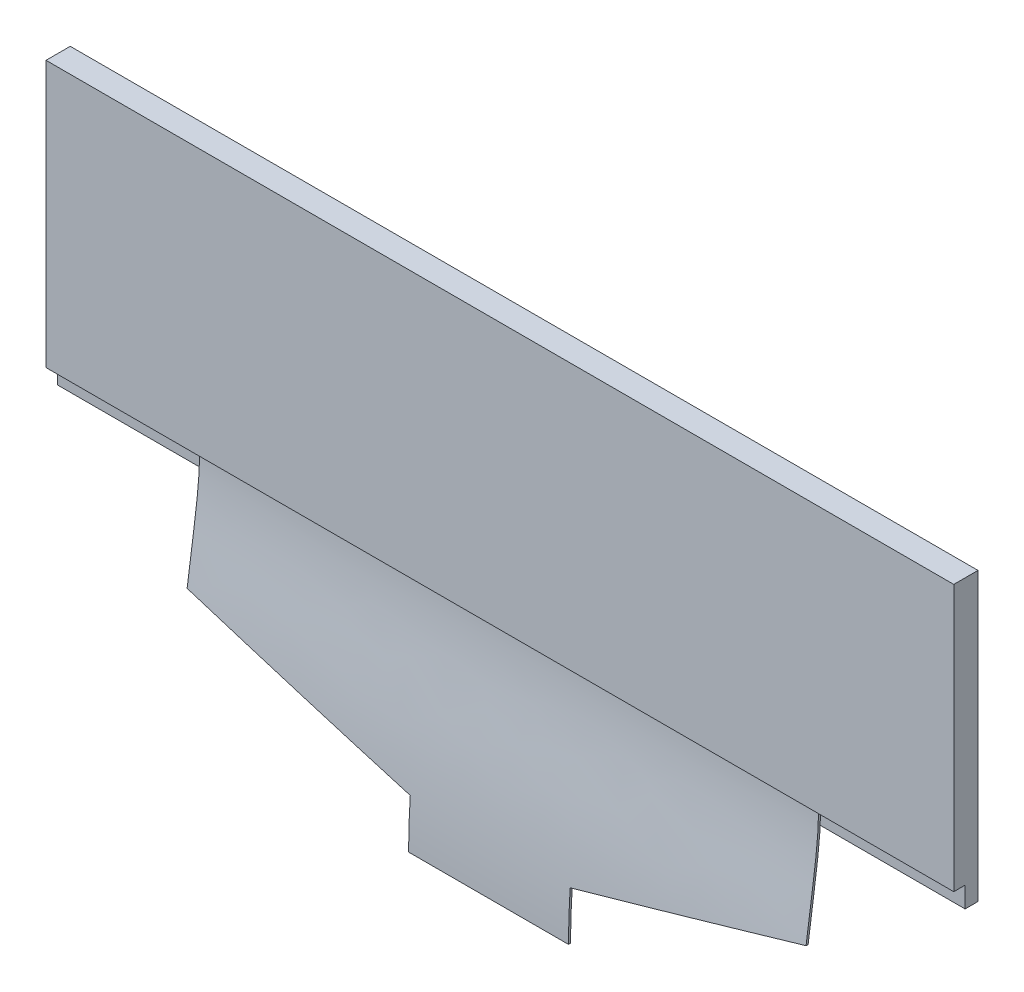
ISO-10303-21;
HEADER;
FILE_DESCRIPTION(('STEP AP214'),'2;1');
FILE_NAME('part.step','',(''),(''),'','','');
FILE_SCHEMA(('AUTOMOTIVE_DESIGN { 1 0 10303 214 1 1 1 1 }'));
ENDSEC;
DATA;
#1=APPLICATION_CONTEXT('core data for automotive mechanical design processes');
#2=APPLICATION_PROTOCOL_DEFINITION('international standard','automotive_design',2000,#1);
#3=PRODUCT_CONTEXT('',#1,'mechanical');
#4=PRODUCT('Part','Part','',(#3));
#5=PRODUCT_RELATED_PRODUCT_CATEGORY('part','',(#4));
#6=PRODUCT_DEFINITION_FORMATION('','',#4);
#7=PRODUCT_DEFINITION_CONTEXT('part definition',#1,'design');
#8=PRODUCT_DEFINITION('design','',#6,#7);
#9=PRODUCT_DEFINITION_SHAPE('','',#8);
#10=(LENGTH_UNIT() NAMED_UNIT(*) SI_UNIT(.MILLI.,.METRE.));
#11=(NAMED_UNIT(*) PLANE_ANGLE_UNIT() SI_UNIT($,.RADIAN.));
#12=(NAMED_UNIT(*) SI_UNIT($,.STERADIAN.) SOLID_ANGLE_UNIT());
#13=UNCERTAINTY_MEASURE_WITH_UNIT(LENGTH_MEASURE(1.E-05),#10,'distance_accuracy_value','');
#14=(GEOMETRIC_REPRESENTATION_CONTEXT(3) GLOBAL_UNCERTAINTY_ASSIGNED_CONTEXT((#13)) GLOBAL_UNIT_ASSIGNED_CONTEXT((#10,
#11,#12)) REPRESENTATION_CONTEXT('',''));
#15=CARTESIAN_POINT('',(0.,0.,0.));
#16=DIRECTION('',(0.,0.,1.));
#17=DIRECTION('',(1.,0.,0.));
#18=AXIS2_PLACEMENT_3D('',#15,#16,#17);
#19=CARTESIAN_POINT('',(74.,-36.0727483844429,2.25));
#20=DIRECTION('',(-1.,0.,0.));
#21=DIRECTION('',(0.,0.,1.));
#22=AXIS2_PLACEMENT_3D('',#19,#20,#21);
#23=PLANE('',#22);
#24=CARTESIAN_POINT('',(74.,-37.2,2.47194810291491));
#25=CARTESIAN_POINT('',(74.,-37.1737177818371,2.67021369500906));
#26=B_SPLINE_CURVE_WITH_KNOTS('',1,(#24,#25),.UNSPECIFIED.,.F.,.F.,(2,2),(0.,1.),.UNSPECIFIED.);
#27=CARTESIAN_POINT('',(74.,-37.1999999999987,2.47194810291474));
#28=VERTEX_POINT('',#27);
#29=CARTESIAN_POINT('',(74.,-37.1737177818365,2.67021369500897));
#30=VERTEX_POINT('',#29);
#31=EDGE_CURVE('E12',#28,#30,#26,.T.);
#32=ORIENTED_EDGE('',*,*,#31,.F.);
#33=CARTESIAN_POINT('',(74.,-26.3,1.25));
#34=CARTESIAN_POINT('',(74.,-31.6877534208741,1.25));
#35=CARTESIAN_POINT('',(74.,-38.5032401168975,3.25));
#36=CARTESIAN_POINT('',(74.,-47.8,3.25));
#37=B_SPLINE_CURVE_WITH_KNOTS('',3,(#33,#34,#35,#36),.UNSPECIFIED.,.F.,.F.,(4,4),(0.,1.),.UNSPECIFIED.);
#38=CARTESIAN_POINT('',(74.,-26.3,1.25));
#39=VERTEX_POINT('',#38);
#40=EDGE_CURVE('E218',#39,#28,#37,.T.);
#41=ORIENTED_EDGE('',*,*,#40,.F.);
#42=DIRECTION('',(0.,0.,1.));
#43=VECTOR('',#42,1.);
#44=CARTESIAN_POINT('',(74.,-26.3,1.25));
#45=LINE('',#44,#43);
#46=CARTESIAN_POINT('',(74.,-26.3,1.45));
#47=VERTEX_POINT('',#46);
#48=EDGE_CURVE('E69',#39,#47,#45,.T.);
#49=ORIENTED_EDGE('',*,*,#48,.T.);
#50=CARTESIAN_POINT('',(74.,-26.3,1.45));
#51=CARTESIAN_POINT('',(74.,-26.6397693571067,1.45009365748943));
#52=CARTESIAN_POINT('',(74.,-26.9794047223198,1.45802947466129));
#53=CARTESIAN_POINT('',(74.,-27.6709253671553,1.4870747870607));
#54=CARTESIAN_POINT('',(74.,-28.0227910689281,1.50866840434903));
#55=CARTESIAN_POINT('',(74.,-28.7391966397183,1.56308328142503));
#56=CARTESIAN_POINT('',(74.,-29.1037043467077,1.59630384357503));
#57=CARTESIAN_POINT('',(74.,-29.8458941504341,1.67219477080209));
#58=CARTESIAN_POINT('',(74.,-30.2235435489757,1.71517953643358));
#59=CARTESIAN_POINT('',(74.,-31.3987912266685,1.85802558716866));
#60=CARTESIAN_POINT('',(74.,-32.1951404284578,1.96786548047808));
#61=CARTESIAN_POINT('',(74.,-33.8462189876175,2.20221560718869));
#62=CARTESIAN_POINT('',(74.,-34.7008736190132,2.32720902601063));
#63=CARTESIAN_POINT('',(74.,-36.4724323689785,2.57747766069083));
#64=CARTESIAN_POINT('',(74.,-37.3894279501499,2.7021369153617));
#65=CARTESIAN_POINT('',(74.,-39.289517191184,2.93703821539683));
#66=CARTESIAN_POINT('',(74.,-40.2728124507725,3.04569545264192));
#67=CARTESIAN_POINT('',(74.,-42.3094961287863,3.2337668127472));
#68=CARTESIAN_POINT('',(74.,-43.3631237896412,3.31070363138037));
#69=CARTESIAN_POINT('',(74.,-44.9718249309836,3.39169771241779));
#70=CARTESIAN_POINT('',(74.,-45.5260564072264,3.41301392197161));
#71=CARTESIAN_POINT('',(74.,-46.6535063245089,3.44241419902836));
#72=CARTESIAN_POINT('',(74.,-47.2267369236599,3.45002952211468));
#73=CARTESIAN_POINT('',(74.,-47.8000000000016,3.45));
#74=B_SPLINE_CURVE_WITH_KNOTS('',3,(#50,#51,#52,#53,#54,#55,#56,#57,#58,#59,#60,#61,#62,#63,#64,
#65,#66,#67,#68,#69,#70,#71,#72,#73),.UNSPECIFIED.,.F.,.F.,(4,2,2,2,2,2,2,2,2,2,2,4),(0.,
1.01902823823575,2.07637283814136,3.1743196888721,4.314509508928,6.72598101723342,
9.31727145110655,12.0934132697868,15.060803030667,18.2290538716837,19.892823987149,
21.6125057749188),.UNSPECIFIED.);
#75=EDGE_CURVE('E159',#47,#30,#74,.T.);
#76=ORIENTED_EDGE('',*,*,#75,.T.);
#77=EDGE_LOOP('',(#32,#41,#49,#76));
#78=FACE_BOUND('',#77,.T.);
#79=ADVANCED_FACE('F55',(#78),#23,.F.);
#80=CARTESIAN_POINT('',(14.,-26.3,1.25));
#81=DIRECTION('',(0.,-1.,0.));
#82=DIRECTION('',(1.,0.,0.));
#83=AXIS2_PLACEMENT_3D('',#80,#81,#82);
#84=PLANE('',#83);
#85=ORIENTED_EDGE('',*,*,#48,.F.);
#86=DIRECTION('',(1.,0.,0.));
#87=VECTOR('',#86,1.);
#88=CARTESIAN_POINT('',(0.,-26.3,1.25));
#89=LINE('',#88,#87);
#90=CARTESIAN_POINT('',(14.,-26.3,1.25));
#91=VERTEX_POINT('',#90);
#92=EDGE_CURVE('E212',#91,#39,#89,.T.);
#93=ORIENTED_EDGE('',*,*,#92,.F.);
#94=DIRECTION('',(0.,0.,1.));
#95=VECTOR('',#94,1.);
#96=CARTESIAN_POINT('',(14.,-26.3,1.25));
#97=LINE('',#96,#95);
#98=CARTESIAN_POINT('',(14.,-26.3,1.45));
#99=VERTEX_POINT('',#98);
#100=EDGE_CURVE('E118',#91,#99,#97,.T.);
#101=ORIENTED_EDGE('',*,*,#100,.T.);
#102=DIRECTION('',(1.,0.,0.));
#103=VECTOR('',#102,1.);
#104=CARTESIAN_POINT('',(0.,-26.3,1.45));
#105=LINE('',#104,#103);
#106=EDGE_CURVE('E154',#99,#47,#105,.T.);
#107=ORIENTED_EDGE('',*,*,#106,.T.);
#108=EDGE_LOOP('',(#85,#93,#101,#107));
#109=FACE_BOUND('',#108,.T.);
#110=ADVANCED_FACE('F351',(#109),#84,.F.);
#111=CARTESIAN_POINT('',(14.,-36.0727483844429,2.25));
#112=DIRECTION('',(-1.,0.,0.));
#113=DIRECTION('',(0.,0.,1.));
#114=AXIS2_PLACEMENT_3D('',#111,#112,#113);
#115=PLANE('',#114);
#116=ORIENTED_EDGE('',*,*,#100,.F.);
#117=CARTESIAN_POINT('',(14.,-26.3,1.25));
#118=CARTESIAN_POINT('',(14.,-31.6877534208741,1.25));
#119=CARTESIAN_POINT('',(14.,-38.5032401168975,3.25));
#120=CARTESIAN_POINT('',(14.,-47.8,3.25));
#121=B_SPLINE_CURVE_WITH_KNOTS('',3,(#117,#118,#119,#120),.UNSPECIFIED.,.F.,.F.,(4,4),(0.,1.),.UNSPECIFIED.);
#122=CARTESIAN_POINT('',(14.,-37.2,2.47194810291491));
#123=VERTEX_POINT('',#122);
#124=EDGE_CURVE('E219',#123,#91,#121,.F.);
#125=ORIENTED_EDGE('',*,*,#124,.F.);
#126=CARTESIAN_POINT('',(14.,-37.1737177818372,2.67021369500906));
#127=CARTESIAN_POINT('',(14.,-37.2,2.47194810291491));
#128=B_SPLINE_CURVE_WITH_KNOTS('',1,(#126,#127),.UNSPECIFIED.,.F.,.F.,(2,2),(0.,1.),.UNSPECIFIED.);
#129=CARTESIAN_POINT('',(14.,-37.1737177818372,2.67021369500906));
#130=VERTEX_POINT('',#129);
#131=EDGE_CURVE('E312',#123,#130,#128,.F.);
#132=ORIENTED_EDGE('',*,*,#131,.T.);
#133=CARTESIAN_POINT('',(14.,-26.3,1.45));
#134=CARTESIAN_POINT('',(14.,-26.6397693571067,1.45009365748943));
#135=CARTESIAN_POINT('',(14.,-26.9794047223198,1.45802947466129));
#136=CARTESIAN_POINT('',(14.,-27.6709253671553,1.4870747870607));
#137=CARTESIAN_POINT('',(14.,-28.0227910689281,1.50866840434903));
#138=CARTESIAN_POINT('',(14.,-28.7391966397183,1.56308328142503));
#139=CARTESIAN_POINT('',(14.,-29.1037043467077,1.59630384357503));
#140=CARTESIAN_POINT('',(14.,-29.8458941504341,1.67219477080209));
#141=CARTESIAN_POINT('',(14.,-30.2235435489757,1.71517953643358));
#142=CARTESIAN_POINT('',(14.,-31.3987912266685,1.85802558716866));
#143=CARTESIAN_POINT('',(14.,-32.1951404284578,1.96786548047808));
#144=CARTESIAN_POINT('',(14.,-33.8462189876175,2.20221560718869));
#145=CARTESIAN_POINT('',(14.,-34.7008736190132,2.32720902601063));
#146=CARTESIAN_POINT('',(14.,-36.4724323689785,2.57747766069083));
#147=CARTESIAN_POINT('',(14.,-37.3894279501499,2.7021369153617));
#148=CARTESIAN_POINT('',(14.,-39.289517191184,2.93703821539683));
#149=CARTESIAN_POINT('',(14.,-40.2728124507725,3.04569545264192));
#150=CARTESIAN_POINT('',(14.,-42.3094961287863,3.2337668127472));
#151=CARTESIAN_POINT('',(14.,-43.3631237896412,3.31070363138037));
#152=CARTESIAN_POINT('',(14.,-44.9718249309836,3.39169771241779));
#153=CARTESIAN_POINT('',(14.,-45.5260564072264,3.41301392197161));
#154=CARTESIAN_POINT('',(14.,-46.6535063245089,3.44241419902836));
#155=CARTESIAN_POINT('',(14.,-47.2267369236599,3.45002952211468));
#156=CARTESIAN_POINT('',(14.,-47.8000000000016,3.45));
#157=B_SPLINE_CURVE_WITH_KNOTS('',3,(#133,#134,#135,#136,#137,#138,#139,#140,#141,#142,#143,
#144,#145,#146,#147,#148,#149,#150,#151,#152,#153,#154,#155,#156),.UNSPECIFIED.,.F.,.F.,(4,2,2,
2,2,2,2,2,2,2,2,4),(0.,1.01902823823575,2.07637283814136,3.1743196888721,4.314509508928,
6.72598101723342,9.31727145110655,12.0934132697868,15.060803030667,18.2290538716837,
19.892823987149,21.6125057749188),.UNSPECIFIED.);
#158=EDGE_CURVE('E401',#130,#99,#157,.F.);
#159=ORIENTED_EDGE('',*,*,#158,.T.);
#160=EDGE_LOOP('',(#116,#125,#132,#159));
#161=FACE_BOUND('',#160,.T.);
#162=ADVANCED_FACE('F270',(#161),#115,.T.);
#163=CARTESIAN_POINT('',(36.25,-43.1263760429437,3.28711904504695));
#164=CARTESIAN_POINT('',(32.540762692798,-42.1334665409442,3.21932478704827));
#165=CARTESIAN_POINT('',(28.8320448135445,-41.1408854028491,3.13138893319346));
#166=CARTESIAN_POINT('',(21.4154597362047,-39.1565840202594,2.92256320759811));
#167=CARTESIAN_POINT('',(17.707595932053,-38.1648623267053,2.8016004721296));
#168=CARTESIAN_POINT('',(14.,-37.1737177818372,2.67021369500906));
#169=CARTESIAN_POINT('',(36.25,-43.14,3.08758361512502));
#170=CARTESIAN_POINT('',(32.5407623077766,-42.1497585666604,3.01997152854752));
#171=CARTESIAN_POINT('',(28.8320448135445,-41.1596560086496,2.93225985811062));
#172=CARTESIAN_POINT('',(21.4154597362047,-39.1796777902497,2.72388909762629));
#173=CARTESIAN_POINT('',(17.7075952557461,-38.1898029581632,2.60315703841357));
#174=CARTESIAN_POINT('',(14.,-37.2,2.47194810291491));
#175=B_SPLINE_SURFACE_WITH_KNOTS('',1,3,((#163,#164,#165,#166,#167,#168),(#169,#170,#171,#172,
#173,#174)),.UNSPECIFIED.,.F.,.F.,.F.,(2,2),(4,2,4),(0.,1.),(0.,0.0115187359016072,
0.0230374718032143),.UNSPECIFIED.);
#176=CARTESIAN_POINT('',(36.25,-43.14,3.08758361512502));
#177=CARTESIAN_POINT('',(35.2837745384965,-42.8820501477435,3.06997408860622));
#178=CARTESIAN_POINT('',(34.3175734842514,-42.6241029743356,3.05100509166875));
#179=CARTESIAN_POINT('',(32.3963483378387,-42.111189342929,3.01069850983635));
#180=CARTESIAN_POINT('',(31.4413236535939,-41.8562227637527,2.98939071366894));
#181=CARTESIAN_POINT('',(29.5424514551293,-41.3492747618038,2.94460800597808));
#182=CARTESIAN_POINT('',(28.5986033232696,-41.0972931608037,2.92116122801674));
#183=CARTESIAN_POINT('',(26.7220841977131,-40.5963175463986,2.87231364662723));
#184=CARTESIAN_POINT('',(25.7894125747402,-40.3473233225918,2.84693912913549));
#185=CARTESIAN_POINT('',(23.9352464858755,-39.8523233740744,2.79445531134856));
#186=CARTESIAN_POINT('',(23.0137513900682,-39.6063174269636,2.76737031234618));
#187=CARTESIAN_POINT('',(21.1819383233372,-39.11729320505,2.71169303315402));
#188=CARTESIAN_POINT('',(20.2716197343101,-38.8742747195586,2.68312289989757));
#189=CARTESIAN_POINT('',(18.4621597136377,-38.391223086701,2.62470872277245));
#190=CARTESIAN_POINT('',(17.5630176868315,-38.1511897622821,2.59488452191252));
#191=CARTESIAN_POINT('',(15.7759105280287,-37.6741037582177,2.53420942046989));
#192=CARTESIAN_POINT('',(14.8879448391939,-37.4370509685323,2.50337580247781));
#193=CARTESIAN_POINT('',(14.,-37.2,2.47194810291491));
#194=B_SPLINE_CURVE_WITH_KNOTS('',3,(#176,#177,#178,#179,#180,#181,#182,#183,#184,#185,#186,
#187,#188,#189,#190,#191,#192,#193),.UNSPECIFIED.,.F.,.F.,(4,2,2,2,2,2,2,2,4),(0.,
3.00065830938138,5.96676485253831,8.8983221333023,11.7953294773301,14.657783065004,
17.4856760116745,20.2789985014996,23.0377379817854),.UNSPECIFIED.);
#195=CARTESIAN_POINT('',(36.25,-43.14,3.08758361512502));
#196=VERTEX_POINT('',#195);
#197=EDGE_CURVE('E211',#196,#123,#194,.T.);
#198=CARTESIAN_POINT('',(36.25,-43.14,3.08758361512502));
#199=CARTESIAN_POINT('',(36.25,-43.1263760429437,3.28711904504695));
#200=B_SPLINE_CURVE_WITH_KNOTS('',1,(#198,#199),.UNSPECIFIED.,.F.,.F.,(2,2),(0.,1.),.UNSPECIFIED.);
#201=CARTESIAN_POINT('',(36.2499995,-43.1263759091009,3.28711903590838));
#202=VERTEX_POINT('',#201);
#203=EDGE_CURVE('E300',#196,#202,#200,.T.);
#204=CARTESIAN_POINT('',(36.25,-43.1263760429437,3.28711904504695));
#205=CARTESIAN_POINT('',(32.540762692798,-42.1334665409442,3.21932478704827));
#206=CARTESIAN_POINT('',(28.8320448135445,-41.1408854028491,3.13138893319346));
#207=CARTESIAN_POINT('',(21.4154597362047,-39.1565840202594,2.92256320759811));
#208=CARTESIAN_POINT('',(17.707595932053,-38.1648623267053,2.8016004721296));
#209=CARTESIAN_POINT('',(14.,-37.1737177818372,2.67021369500906));
#210=B_SPLINE_CURVE_WITH_KNOTS('',3,(#204,#205,#206,#207,#208,#209),.UNSPECIFIED.,.F.,.F.,(4,2,
4),(0.,0.0115187359016072,0.0230374718032143),.UNSPECIFIED.);
#211=EDGE_CURVE('E153',#202,#130,#210,.T.);
#212=ORIENTED_EDGE('',*,*,#131,.F.);
#213=ORIENTED_EDGE('',*,*,#197,.F.);
#214=ORIENTED_EDGE('',*,*,#203,.T.);
#215=ORIENTED_EDGE('',*,*,#211,.T.);
#216=EDGE_LOOP('',(#212,#213,#214,#215));
#217=FACE_BOUND('',#216,.T.);
#218=ADVANCED_FACE('F257',(#217),#175,.F.);
#219=CARTESIAN_POINT('',(36.25,-36.0727483844429,2.25));
#220=DIRECTION('',(-1.,0.,0.));
#221=DIRECTION('',(0.,0.,1.));
#222=AXIS2_PLACEMENT_3D('',#219,#220,#221);
#223=PLANE('',#222);
#224=ORIENTED_EDGE('',*,*,#203,.F.);
#225=CARTESIAN_POINT('',(36.25,-26.3,1.25));
#226=CARTESIAN_POINT('',(36.25,-31.6877534208741,1.25));
#227=CARTESIAN_POINT('',(36.25,-38.5032401168975,3.25));
#228=CARTESIAN_POINT('',(36.25,-47.8,3.25));
#229=B_SPLINE_CURVE_WITH_KNOTS('',3,(#225,#226,#227,#228),.UNSPECIFIED.,.F.,.F.,(4,4),(0.,1.),.UNSPECIFIED.);
#230=CARTESIAN_POINT('',(36.25,-47.8,3.25));
#231=VERTEX_POINT('',#230);
#232=EDGE_CURVE('E215',#231,#196,#229,.F.);
#233=ORIENTED_EDGE('',*,*,#232,.F.);
#234=DIRECTION('',(0.,0.,1.));
#235=VECTOR('',#234,1.);
#236=CARTESIAN_POINT('',(36.25,-47.8,3.25));
#237=LINE('',#236,#235);
#238=CARTESIAN_POINT('',(36.25,-47.8,3.45));
#239=VERTEX_POINT('',#238);
#240=EDGE_CURVE('E142',#231,#239,#237,.T.);
#241=ORIENTED_EDGE('',*,*,#240,.T.);
#242=CARTESIAN_POINT('',(36.25,-26.3,1.45));
#243=CARTESIAN_POINT('',(36.25,-26.6397693571067,1.45009365748943));
#244=CARTESIAN_POINT('',(36.25,-26.9794047223198,1.45802947466129));
#245=CARTESIAN_POINT('',(36.25,-27.6709253671553,1.4870747870607));
#246=CARTESIAN_POINT('',(36.25,-28.0227910689281,1.50866840434903));
#247=CARTESIAN_POINT('',(36.25,-28.7391966397183,1.56308328142503));
#248=CARTESIAN_POINT('',(36.25,-29.1037043467077,1.59630384357503));
#249=CARTESIAN_POINT('',(36.25,-29.8458941504341,1.67219477080209));
#250=CARTESIAN_POINT('',(36.25,-30.2235435489757,1.71517953643358));
#251=CARTESIAN_POINT('',(36.25,-31.3987912266685,1.85802558716866));
#252=CARTESIAN_POINT('',(36.25,-32.1951404284578,1.96786548047808));
#253=CARTESIAN_POINT('',(36.25,-33.8462189876175,2.20221560718869));
#254=CARTESIAN_POINT('',(36.25,-34.7008736190132,2.32720902601063));
#255=CARTESIAN_POINT('',(36.25,-36.4724323689785,2.57747766069083));
#256=CARTESIAN_POINT('',(36.25,-37.3894279501499,2.7021369153617));
#257=CARTESIAN_POINT('',(36.25,-39.289517191184,2.93703821539683));
#258=CARTESIAN_POINT('',(36.25,-40.2728124507725,3.04569545264192));
#259=CARTESIAN_POINT('',(36.25,-42.3094961287863,3.2337668127472));
#260=CARTESIAN_POINT('',(36.25,-43.3631237896412,3.31070363138037));
#261=CARTESIAN_POINT('',(36.25,-44.9718249309836,3.39169771241779));
#262=CARTESIAN_POINT('',(36.25,-45.5260564072264,3.41301392197161));
#263=CARTESIAN_POINT('',(36.25,-46.6535063245089,3.44241419902836));
#264=CARTESIAN_POINT('',(36.25,-47.2267369236599,3.45002952211468));
#265=CARTESIAN_POINT('',(36.25,-47.8000000000016,3.45));
#266=B_SPLINE_CURVE_WITH_KNOTS('',3,(#242,#243,#244,#245,#246,#247,#248,#249,#250,#251,#252,
#253,#254,#255,#256,#257,#258,#259,#260,#261,#262,#263,#264,#265),.UNSPECIFIED.,.F.,.F.,(4,2,2,
2,2,2,2,2,2,2,2,4),(0.,1.01902823823575,2.07637283814136,3.1743196888721,4.314509508928,
6.72598101723342,9.31727145110655,12.0934132697868,15.060803030667,18.2290538716837,
19.892823987149,21.6125057749188),.UNSPECIFIED.);
#267=EDGE_CURVE('E152',#239,#202,#266,.F.);
#268=ORIENTED_EDGE('',*,*,#267,.T.);
#269=EDGE_LOOP('',(#224,#233,#241,#268));
#270=FACE_BOUND('',#269,.T.);
#271=ADVANCED_FACE('F269',(#270),#223,.T.);
#272=CARTESIAN_POINT('',(36.25,-47.8,3.25));
#273=DIRECTION('',(0.,-1.,0.));
#274=DIRECTION('',(1.,0.,0.));
#275=AXIS2_PLACEMENT_3D('',#272,#273,#274);
#276=PLANE('',#275);
#277=ORIENTED_EDGE('',*,*,#240,.F.);
#278=DIRECTION('',(1.,0.,0.));
#279=VECTOR('',#278,1.);
#280=CARTESIAN_POINT('',(0.,-47.8,3.25));
#281=LINE('',#280,#279);
#282=CARTESIAN_POINT('',(51.75,-47.8,3.25));
#283=VERTEX_POINT('',#282);
#284=EDGE_CURVE('E140',#231,#283,#281,.T.);
#285=ORIENTED_EDGE('',*,*,#284,.T.);
#286=DIRECTION('',(0.,0.,1.));
#287=VECTOR('',#286,1.);
#288=CARTESIAN_POINT('',(51.75,-47.8,3.25));
#289=LINE('',#288,#287);
#290=CARTESIAN_POINT('',(51.75,-47.8,3.45));
#291=VERTEX_POINT('',#290);
#292=EDGE_CURVE('E135',#283,#291,#289,.T.);
#293=ORIENTED_EDGE('',*,*,#292,.T.);
#294=DIRECTION('',(1.,0.,0.));
#295=VECTOR('',#294,1.);
#296=CARTESIAN_POINT('',(0.,-47.8,3.45));
#297=LINE('',#296,#295);
#298=EDGE_CURVE('E138',#239,#291,#297,.T.);
#299=ORIENTED_EDGE('',*,*,#298,.F.);
#300=EDGE_LOOP('',(#277,#285,#293,#299));
#301=FACE_BOUND('',#300,.T.);
#302=ADVANCED_FACE('F137',(#301),#276,.T.);
#303=CARTESIAN_POINT('',(51.75,-36.0727483844429,2.25));
#304=DIRECTION('',(-1.,0.,0.));
#305=DIRECTION('',(0.,0.,1.));
#306=AXIS2_PLACEMENT_3D('',#303,#304,#305);
#307=PLANE('',#306);
#308=ORIENTED_EDGE('',*,*,#292,.F.);
#309=CARTESIAN_POINT('',(51.75,-26.3,1.25));
#310=CARTESIAN_POINT('',(51.75,-31.6877534208741,1.25));
#311=CARTESIAN_POINT('',(51.75,-38.5032401168975,3.25));
#312=CARTESIAN_POINT('',(51.75,-47.8,3.25));
#313=B_SPLINE_CURVE_WITH_KNOTS('',3,(#309,#310,#311,#312),.UNSPECIFIED.,.F.,.F.,(4,4),(0.,1.),.UNSPECIFIED.);
#314=CARTESIAN_POINT('',(51.75,-43.14,3.08758361512502));
#315=VERTEX_POINT('',#314);
#316=EDGE_CURVE('E358',#315,#283,#313,.T.);
#317=ORIENTED_EDGE('',*,*,#316,.F.);
#318=CARTESIAN_POINT('',(51.75,-43.1263760429437,3.28711904504695));
#319=CARTESIAN_POINT('',(51.75,-43.14,3.08758361512502));
#320=B_SPLINE_CURVE_WITH_KNOTS('',1,(#318,#319),.UNSPECIFIED.,.F.,.F.,(2,2),(0.,1.),.UNSPECIFIED.);
#321=CARTESIAN_POINT('',(51.75,-43.1263760429437,3.28711904504695));
#322=VERTEX_POINT('',#321);
#323=EDGE_CURVE('E77',#315,#322,#320,.F.);
#324=ORIENTED_EDGE('',*,*,#323,.T.);
#325=CARTESIAN_POINT('',(51.75,-26.3,1.45));
#326=CARTESIAN_POINT('',(51.75,-26.6397693571067,1.45009365748943));
#327=CARTESIAN_POINT('',(51.75,-26.9794047223198,1.45802947466129));
#328=CARTESIAN_POINT('',(51.75,-27.6709253671553,1.4870747870607));
#329=CARTESIAN_POINT('',(51.75,-28.0227910689281,1.50866840434903));
#330=CARTESIAN_POINT('',(51.75,-28.7391966397183,1.56308328142503));
#331=CARTESIAN_POINT('',(51.75,-29.1037043467077,1.59630384357503));
#332=CARTESIAN_POINT('',(51.75,-29.8458941504341,1.67219477080209));
#333=CARTESIAN_POINT('',(51.75,-30.2235435489757,1.71517953643358));
#334=CARTESIAN_POINT('',(51.75,-31.3987912266685,1.85802558716866));
#335=CARTESIAN_POINT('',(51.75,-32.1951404284578,1.96786548047808));
#336=CARTESIAN_POINT('',(51.75,-33.8462189876175,2.20221560718869));
#337=CARTESIAN_POINT('',(51.75,-34.7008736190132,2.32720902601063));
#338=CARTESIAN_POINT('',(51.75,-36.4724323689785,2.57747766069083));
#339=CARTESIAN_POINT('',(51.75,-37.3894279501499,2.7021369153617));
#340=CARTESIAN_POINT('',(51.75,-39.289517191184,2.93703821539683));
#341=CARTESIAN_POINT('',(51.75,-40.2728124507725,3.04569545264192));
#342=CARTESIAN_POINT('',(51.75,-42.3094961287863,3.2337668127472));
#343=CARTESIAN_POINT('',(51.75,-43.3631237896412,3.31070363138037));
#344=CARTESIAN_POINT('',(51.75,-44.9718249309836,3.39169771241779));
#345=CARTESIAN_POINT('',(51.75,-45.5260564072264,3.41301392197161));
#346=CARTESIAN_POINT('',(51.75,-46.6535063245089,3.44241419902836));
#347=CARTESIAN_POINT('',(51.75,-47.2267369236599,3.45002952211468));
#348=CARTESIAN_POINT('',(51.75,-47.8000000000016,3.45));
#349=B_SPLINE_CURVE_WITH_KNOTS('',3,(#325,#326,#327,#328,#329,#330,#331,#332,#333,#334,#335,
#336,#337,#338,#339,#340,#341,#342,#343,#344,#345,#346,#347,#348),.UNSPECIFIED.,.F.,.F.,(4,2,2,
2,2,2,2,2,2,2,2,4),(0.,1.01902823823575,2.07637283814136,3.1743196888721,4.314509508928,
6.72598101723342,9.31727145110655,12.0934132697868,15.060803030667,18.2290538716837,
19.892823987149,21.6125057749188),.UNSPECIFIED.);
#350=EDGE_CURVE('E149',#322,#291,#349,.T.);
#351=ORIENTED_EDGE('',*,*,#350,.T.);
#352=EDGE_LOOP('',(#308,#317,#324,#351));
#353=FACE_BOUND('',#352,.T.);
#354=ADVANCED_FACE('F156',(#353),#307,.F.);
#355=CARTESIAN_POINT('',(74.,-37.1737177818371,2.67021369500906));
#356=CARTESIAN_POINT('',(70.2924040679464,-38.1648623267054,2.80160047212962));
#357=CARTESIAN_POINT('',(66.584540263795,-39.1565840202594,2.92256320759812));
#358=CARTESIAN_POINT('',(59.1679551864554,-41.1408854028491,3.13138893319347));
#359=CARTESIAN_POINT('',(55.459237307202,-42.1334665409442,3.21932478704827));
#360=CARTESIAN_POINT('',(51.75,-43.1263760429437,3.28711904504695));
#361=CARTESIAN_POINT('',(74.,-37.2,2.47194810291491));
#362=CARTESIAN_POINT('',(70.2924047442534,-38.1898029581634,2.60315703841359));
#363=CARTESIAN_POINT('',(66.584540263795,-39.1796777902498,2.72388909762629));
#364=CARTESIAN_POINT('',(59.1679551864554,-41.1596560086496,2.93225985811062));
#365=CARTESIAN_POINT('',(55.4592376922233,-42.1497585666604,3.01997152854752));
#366=CARTESIAN_POINT('',(51.75,-43.14,3.08758361512502));
#367=B_SPLINE_SURFACE_WITH_KNOTS('',1,3,((#355,#356,#357,#358,#359,#360),(#361,#362,#363,#364,
#365,#366)),.UNSPECIFIED.,.F.,.F.,.F.,(2,2),(4,2,4),(0.,1.),(0.,0.0115187359016073,
0.0230374718032143),.UNSPECIFIED.);
#368=CARTESIAN_POINT('',(74.,-37.2,2.47194810291491));
#369=CARTESIAN_POINT('',(73.1120551608061,-37.4370509685323,2.50337580247781));
#370=CARTESIAN_POINT('',(72.2240894719713,-37.6741037582177,2.53420942046989));
#371=CARTESIAN_POINT('',(70.4369823131685,-38.1511897622821,2.59488452191252));
#372=CARTESIAN_POINT('',(69.5378402863623,-38.391223086701,2.62470872277245));
#373=CARTESIAN_POINT('',(67.7283802656899,-38.8742747195586,2.68312289989757));
#374=CARTESIAN_POINT('',(66.8180616766628,-39.11729320505,2.71169303315402));
#375=CARTESIAN_POINT('',(64.9862486099318,-39.6063174269636,2.76737031234617));
#376=CARTESIAN_POINT('',(64.0647535141245,-39.8523233740744,2.79445531134856));
#377=CARTESIAN_POINT('',(62.2105874252598,-40.3473233225918,2.84693912913549));
#378=CARTESIAN_POINT('',(61.2779158022869,-40.5963175463986,2.87231364662723));
#379=CARTESIAN_POINT('',(59.4013966767304,-41.0972931608037,2.92116122801674));
#380=CARTESIAN_POINT('',(58.4575485448707,-41.3492747618038,2.94460800597808));
#381=CARTESIAN_POINT('',(56.5586763464061,-41.8562227637527,2.98939071366894));
#382=CARTESIAN_POINT('',(55.6036516621613,-42.111189342929,3.01069850983635));
#383=CARTESIAN_POINT('',(53.6824265157486,-42.6241029743357,3.05100509166875));
#384=CARTESIAN_POINT('',(52.7162254615035,-42.8820501477436,3.06997408860622));
#385=CARTESIAN_POINT('',(51.75,-43.14,3.08758361512502));
#386=B_SPLINE_CURVE_WITH_KNOTS('',3,(#368,#369,#370,#371,#372,#373,#374,#375,#376,#377,#378,
#379,#380,#381,#382,#383,#384,#385),.UNSPECIFIED.,.F.,.F.,(4,2,2,2,2,2,2,2,4),(0.,
2.75873948028579,5.55206197011084,8.37995491678134,11.2424085044553,14.1394158484831,
17.0709731292471,20.037079672404,23.0377379817854),.UNSPECIFIED.);
#387=EDGE_CURVE('E357',#28,#315,#386,.T.);
#388=CARTESIAN_POINT('',(74.,-37.1737177818371,2.67021369500906));
#389=CARTESIAN_POINT('',(70.2924040679464,-38.1648623267054,2.80160047212962));
#390=CARTESIAN_POINT('',(66.584540263795,-39.1565840202594,2.92256320759812));
#391=CARTESIAN_POINT('',(59.1679551864554,-41.1408854028491,3.13138893319347));
#392=CARTESIAN_POINT('',(55.459237307202,-42.1334665409442,3.21932478704827));
#393=CARTESIAN_POINT('',(51.75,-43.1263760429437,3.28711904504695));
#394=B_SPLINE_CURVE_WITH_KNOTS('',3,(#388,#389,#390,#391,#392,#393),.UNSPECIFIED.,.F.,.F.,(4,2,
4),(0.,0.0115187359016073,0.0230374718032143),.UNSPECIFIED.);
#395=EDGE_CURVE('E157',#30,#322,#394,.T.);
#396=ORIENTED_EDGE('',*,*,#387,.F.);
#397=ORIENTED_EDGE('',*,*,#31,.T.);
#398=ORIENTED_EDGE('',*,*,#395,.T.);
#399=ORIENTED_EDGE('',*,*,#323,.F.);
#400=EDGE_LOOP('',(#396,#397,#398,#399));
#401=FACE_BOUND('',#400,.T.);
#402=ADVANCED_FACE('F57',(#401),#367,.F.);
#403=CARTESIAN_POINT('',(0.,-26.3,1.25));
#404=CARTESIAN_POINT('',(0.,-31.6877534208741,1.25));
#405=CARTESIAN_POINT('',(0.,-38.5032401168975,3.25));
#406=CARTESIAN_POINT('',(0.,-47.8,3.25));
#407=B_SPLINE_CURVE_WITH_KNOTS('',3,(#403,#404,#405,#406),.UNSPECIFIED.,.F.,.F.,(4,4),(0.,1.),.UNSPECIFIED.);
#408=DIRECTION('',(1.,0.,0.));
#409=VECTOR('',#408,1.);
#410=SURFACE_OF_LINEAR_EXTRUSION('',#407,#409);
#411=OFFSET_SURFACE('',#410,0.2,.F.);
#412=ORIENTED_EDGE('',*,*,#350,.F.);
#413=ORIENTED_EDGE('',*,*,#395,.F.);
#414=ORIENTED_EDGE('',*,*,#75,.F.);
#415=ORIENTED_EDGE('',*,*,#106,.F.);
#416=ORIENTED_EDGE('',*,*,#158,.F.);
#417=ORIENTED_EDGE('',*,*,#211,.F.);
#418=ORIENTED_EDGE('',*,*,#267,.F.);
#419=ORIENTED_EDGE('',*,*,#298,.T.);
#420=EDGE_LOOP('',(#412,#413,#414,#415,#416,#417,#418,#419));
#421=FACE_BOUND('',#420,.T.);
#422=ADVANCED_FACE('F147',(#421),#411,.T.);
#423=CARTESIAN_POINT('',(0.,-26.3,1.25));
#424=CARTESIAN_POINT('',(0.,-31.6877534208741,1.25));
#425=CARTESIAN_POINT('',(0.,-38.5032401168975,3.25));
#426=CARTESIAN_POINT('',(0.,-47.8,3.25));
#427=B_SPLINE_CURVE_WITH_KNOTS('',3,(#423,#424,#425,#426),.UNSPECIFIED.,.F.,.F.,(4,4),(0.,1.),.UNSPECIFIED.);
#428=DIRECTION('',(1.,0.,0.));
#429=VECTOR('',#428,1.);
#430=SURFACE_OF_LINEAR_EXTRUSION('',#427,#429);
#431=ORIENTED_EDGE('',*,*,#316,.T.);
#432=ORIENTED_EDGE('',*,*,#284,.F.);
#433=ORIENTED_EDGE('',*,*,#232,.T.);
#434=ORIENTED_EDGE('',*,*,#197,.T.);
#435=ORIENTED_EDGE('',*,*,#124,.T.);
#436=ORIENTED_EDGE('',*,*,#92,.T.);
#437=ORIENTED_EDGE('',*,*,#40,.T.);
#438=ORIENTED_EDGE('',*,*,#387,.T.);
#439=EDGE_LOOP('',(#431,#432,#433,#434,#435,#436,#437,#438));
#440=FACE_BOUND('',#439,.T.);
#441=ADVANCED_FACE('F179',(#440),#430,.F.);
#442=CLOSED_SHELL('',(#79,#110,#162,#218,#271,#302,#354,#402,#422,#441));
#443=MANIFOLD_SOLID_BREP('B2',#442);
#444=CARTESIAN_POINT('',(0.,0.,0.));
#445=DIRECTION('',(0.,0.,1.));
#446=DIRECTION('',(1.,0.,0.));
#447=AXIS2_PLACEMENT_3D('',#444,#445,#446);
#448=PLANE('',#447);
#449=DIRECTION('',(0.,-1.,0.));
#450=VECTOR('',#449,1.);
#451=CARTESIAN_POINT('',(0.,0.,0.));
#452=LINE('',#451,#450);
#453=CARTESIAN_POINT('',(0.,0.,0.));
#454=VERTEX_POINT('',#453);
#455=CARTESIAN_POINT('',(0.,-27.8,0.));
#456=VERTEX_POINT('',#455);
#457=EDGE_CURVE('E610',#454,#456,#452,.T.);
#458=ORIENTED_EDGE('',*,*,#457,.F.);
#459=DIRECTION('',(-1.,0.,0.));
#460=VECTOR('',#459,1.);
#461=CARTESIAN_POINT('',(0.,0.,0.));
#462=LINE('',#461,#460);
#463=CARTESIAN_POINT('',(88.,0.,0.));
#464=VERTEX_POINT('',#463);
#465=EDGE_CURVE('E728',#464,#454,#462,.T.);
#466=ORIENTED_EDGE('',*,*,#465,.F.);
#467=DIRECTION('',(0.,1.,0.));
#468=VECTOR('',#467,1.);
#469=CARTESIAN_POINT('',(88.,0.,0.));
#470=LINE('',#469,#468);
#471=CARTESIAN_POINT('',(88.,-27.8,0.));
#472=VERTEX_POINT('',#471);
#473=EDGE_CURVE('E738',#472,#464,#470,.T.);
#474=ORIENTED_EDGE('',*,*,#473,.F.);
#475=DIRECTION('',(1.,0.,0.));
#476=VECTOR('',#475,1.);
#477=CARTESIAN_POINT('',(0.,-27.8,0.));
#478=LINE('',#477,#476);
#479=EDGE_CURVE('E734',#456,#472,#478,.T.);
#480=ORIENTED_EDGE('',*,*,#479,.F.);
#481=EDGE_LOOP('',(#458,#466,#474,#480));
#482=FACE_BOUND('',#481,.T.);
#483=DIRECTION('',(0.,-1.,0.));
#484=VECTOR('',#483,1.);
#485=CARTESIAN_POINT('',(82.39,0.,0.));
#486=LINE('',#485,#484);
#487=CARTESIAN_POINT('',(82.39,-3.,0.));
#488=VERTEX_POINT('',#487);
#489=CARTESIAN_POINT('',(82.39,-22.18,0.));
#490=VERTEX_POINT('',#489);
#491=EDGE_CURVE('E53',#488,#490,#486,.T.);
#492=ORIENTED_EDGE('',*,*,#491,.F.);
#493=DIRECTION('',(1.,0.,0.));
#494=VECTOR('',#493,1.);
#495=CARTESIAN_POINT('',(0.,-3.,0.));
#496=LINE('',#495,#494);
#497=CARTESIAN_POINT('',(5.61,-3.,0.));
#498=VERTEX_POINT('',#497);
#499=EDGE_CURVE('E532',#498,#488,#496,.T.);
#500=ORIENTED_EDGE('',*,*,#499,.F.);
#501=DIRECTION('',(0.,1.,0.));
#502=VECTOR('',#501,1.);
#503=CARTESIAN_POINT('',(5.61,0.,0.));
#504=LINE('',#503,#502);
#505=CARTESIAN_POINT('',(5.61,-22.18,0.));
#506=VERTEX_POINT('',#505);
#507=EDGE_CURVE('E617',#506,#498,#504,.T.);
#508=ORIENTED_EDGE('',*,*,#507,.F.);
#509=DIRECTION('',(-1.,0.,0.));
#510=VECTOR('',#509,1.);
#511=CARTESIAN_POINT('',(0.,-22.18,0.));
#512=LINE('',#511,#510);
#513=EDGE_CURVE('E612',#490,#506,#512,.T.);
#514=ORIENTED_EDGE('',*,*,#513,.F.);
#515=EDGE_LOOP('',(#492,#500,#508,#514));
#516=FACE_BOUND('',#515,.T.);
#517=ADVANCED_FACE('F523',(#482,#516),#448,.F.);
#518=CARTESIAN_POINT('',(0.,0.,2.35));
#519=DIRECTION('',(1.,0.,0.));
#520=DIRECTION('',(0.,1.,0.));
#521=AXIS2_PLACEMENT_3D('',#518,#519,#520);
#522=PLANE('',#521);
#523=DIRECTION('',(0.,-1.,0.));
#524=VECTOR('',#523,1.);
#525=CARTESIAN_POINT('',(0.,-27.8,1.25));
#526=LINE('',#525,#524);
#527=CARTESIAN_POINT('',(0.,-25.8,1.25));
#528=VERTEX_POINT('',#527);
#529=CARTESIAN_POINT('',(0.,-27.8,1.25));
#530=VERTEX_POINT('',#529);
#531=EDGE_CURVE('E584',#528,#530,#526,.T.);
#532=ORIENTED_EDGE('',*,*,#531,.F.);
#533=DIRECTION('',(0.,0.,1.));
#534=VECTOR('',#533,1.);
#535=CARTESIAN_POINT('',(0.,-25.8,1.25));
#536=LINE('',#535,#534);
#537=CARTESIAN_POINT('',(0.,-25.8,2.35));
#538=VERTEX_POINT('',#537);
#539=EDGE_CURVE('E735',#528,#538,#536,.T.);
#540=ORIENTED_EDGE('',*,*,#539,.T.);
#541=DIRECTION('',(0.,-1.,0.));
#542=VECTOR('',#541,1.);
#543=CARTESIAN_POINT('',(0.,0.,2.35));
#544=LINE('',#543,#542);
#545=CARTESIAN_POINT('',(0.,0.,2.35));
#546=VERTEX_POINT('',#545);
#547=EDGE_CURVE('E721',#546,#538,#544,.T.);
#548=ORIENTED_EDGE('',*,*,#547,.F.);
#549=DIRECTION('',(0.,0.,-1.));
#550=VECTOR('',#549,1.);
#551=CARTESIAN_POINT('',(0.,0.,2.35));
#552=LINE('',#551,#550);
#553=EDGE_CURVE('E725',#546,#454,#552,.T.);
#554=ORIENTED_EDGE('',*,*,#553,.T.);
#555=ORIENTED_EDGE('',*,*,#457,.T.);
#556=DIRECTION('',(0.,0.,-1.));
#557=VECTOR('',#556,1.);
#558=CARTESIAN_POINT('',(0.,-27.8,2.35));
#559=LINE('',#558,#557);
#560=EDGE_CURVE('E601',#530,#456,#559,.T.);
#561=ORIENTED_EDGE('',*,*,#560,.F.);
#562=EDGE_LOOP('',(#532,#540,#548,#554,#555,#561));
#563=FACE_BOUND('',#562,.T.);
#564=ADVANCED_FACE('F525',(#563),#522,.F.);
#565=CARTESIAN_POINT('',(0.,-27.8,2.35));
#566=DIRECTION('',(0.,1.,0.));
#567=DIRECTION('',(0.,0.,1.));
#568=AXIS2_PLACEMENT_3D('',#565,#566,#567);
#569=PLANE('',#568);
#570=DIRECTION('',(0.,0.,-1.));
#571=VECTOR('',#570,1.);
#572=CARTESIAN_POINT('',(88.,-27.8,2.35));
#573=LINE('',#572,#571);
#574=CARTESIAN_POINT('',(88.,-27.8,1.25));
#575=VERTEX_POINT('',#574);
#576=EDGE_CURVE('E603',#575,#472,#573,.T.);
#577=ORIENTED_EDGE('',*,*,#576,.F.);
#578=DIRECTION('',(1.,0.,0.));
#579=VECTOR('',#578,1.);
#580=CARTESIAN_POINT('',(0.,-27.8,1.25));
#581=LINE('',#580,#579);
#582=EDGE_CURVE('E587',#530,#575,#581,.T.);
#583=ORIENTED_EDGE('',*,*,#582,.F.);
#584=ORIENTED_EDGE('',*,*,#560,.T.);
#585=ORIENTED_EDGE('',*,*,#479,.T.);
#586=EDGE_LOOP('',(#577,#583,#584,#585));
#587=FACE_BOUND('',#586,.T.);
#588=ADVANCED_FACE('F599',(#587),#569,.F.);
#589=CARTESIAN_POINT('',(88.,0.,2.35));
#590=DIRECTION('',(-1.,0.,0.));
#591=DIRECTION('',(0.,0.,1.));
#592=AXIS2_PLACEMENT_3D('',#589,#590,#591);
#593=PLANE('',#592);
#594=DIRECTION('',(0.,1.,0.));
#595=VECTOR('',#594,1.);
#596=CARTESIAN_POINT('',(88.,0.,2.35));
#597=LINE('',#596,#595);
#598=CARTESIAN_POINT('',(88.,-25.8,2.35));
#599=VERTEX_POINT('',#598);
#600=CARTESIAN_POINT('',(88.,0.,2.35));
#601=VERTEX_POINT('',#600);
#602=EDGE_CURVE('E715',#599,#601,#597,.T.);
#603=ORIENTED_EDGE('',*,*,#602,.F.);
#604=DIRECTION('',(0.,0.,1.));
#605=VECTOR('',#604,1.);
#606=CARTESIAN_POINT('',(88.,-25.8,1.25));
#607=LINE('',#606,#605);
#608=CARTESIAN_POINT('',(88.,-25.8,1.25));
#609=VERTEX_POINT('',#608);
#610=EDGE_CURVE('E716',#609,#599,#607,.T.);
#611=ORIENTED_EDGE('',*,*,#610,.F.);
#612=DIRECTION('',(0.,1.,0.));
#613=VECTOR('',#612,1.);
#614=CARTESIAN_POINT('',(88.,-27.8,1.25));
#615=LINE('',#614,#613);
#616=EDGE_CURVE('E605',#575,#609,#615,.T.);
#617=ORIENTED_EDGE('',*,*,#616,.F.);
#618=ORIENTED_EDGE('',*,*,#576,.T.);
#619=ORIENTED_EDGE('',*,*,#473,.T.);
#620=DIRECTION('',(0.,0.,-1.));
#621=VECTOR('',#620,1.);
#622=CARTESIAN_POINT('',(88.,0.,2.35));
#623=LINE('',#622,#621);
#624=EDGE_CURVE('E619',#601,#464,#623,.T.);
#625=ORIENTED_EDGE('',*,*,#624,.F.);
#626=EDGE_LOOP('',(#603,#611,#617,#618,#619,#625));
#627=FACE_BOUND('',#626,.T.);
#628=ADVANCED_FACE('F650',(#627),#593,.F.);
#629=CARTESIAN_POINT('',(0.,0.,2.35));
#630=DIRECTION('',(0.,-1.,0.));
#631=DIRECTION('',(0.,0.,-1.));
#632=AXIS2_PLACEMENT_3D('',#629,#630,#631);
#633=PLANE('',#632);
#634=ORIENTED_EDGE('',*,*,#465,.T.);
#635=ORIENTED_EDGE('',*,*,#553,.F.);
#636=DIRECTION('',(-1.,0.,0.));
#637=VECTOR('',#636,1.);
#638=CARTESIAN_POINT('',(0.,0.,2.35));
#639=LINE('',#638,#637);
#640=EDGE_CURVE('E720',#601,#546,#639,.T.);
#641=ORIENTED_EDGE('',*,*,#640,.F.);
#642=ORIENTED_EDGE('',*,*,#624,.T.);
#643=EDGE_LOOP('',(#634,#635,#641,#642));
#644=FACE_BOUND('',#643,.T.);
#645=ADVANCED_FACE('F645',(#644),#633,.F.);
#646=CARTESIAN_POINT('',(0.,0.,2.35));
#647=DIRECTION('',(0.,0.,1.));
#648=DIRECTION('',(1.,0.,0.));
#649=AXIS2_PLACEMENT_3D('',#646,#647,#648);
#650=PLANE('',#649);
#651=DIRECTION('',(-1.,0.,0.));
#652=VECTOR('',#651,1.);
#653=CARTESIAN_POINT('',(0.,-25.8,2.35));
#654=LINE('',#653,#652);
#655=EDGE_CURVE('E595',#599,#538,#654,.T.);
#656=ORIENTED_EDGE('',*,*,#655,.F.);
#657=ORIENTED_EDGE('',*,*,#602,.T.);
#658=ORIENTED_EDGE('',*,*,#640,.T.);
#659=ORIENTED_EDGE('',*,*,#547,.T.);
#660=EDGE_LOOP('',(#656,#657,#658,#659));
#661=FACE_BOUND('',#660,.T.);
#662=ADVANCED_FACE('F638',(#661),#650,.T.);
#663=ORIENTED_EDGE('',*,*,#499,.T.);
#664=ORIENTED_EDGE('',*,*,#491,.T.);
#665=ORIENTED_EDGE('',*,*,#513,.T.);
#666=ORIENTED_EDGE('',*,*,#507,.T.);
#667=EDGE_LOOP('',(#663,#664,#665,#666));
#668=FACE_BOUND('',#667,.T.);
#669=ADVANCED_FACE('F627',(#668),#448,.F.);
#670=CARTESIAN_POINT('',(0.,-25.8,1.25));
#671=DIRECTION('',(0.,1.,0.));
#672=DIRECTION('',(0.,0.,1.));
#673=AXIS2_PLACEMENT_3D('',#670,#671,#672);
#674=PLANE('',#673);
#675=ORIENTED_EDGE('',*,*,#655,.T.);
#676=ORIENTED_EDGE('',*,*,#539,.F.);
#677=DIRECTION('',(-1.,0.,0.));
#678=VECTOR('',#677,1.);
#679=CARTESIAN_POINT('',(0.,-25.8,1.25));
#680=LINE('',#679,#678);
#681=EDGE_CURVE('E590',#609,#528,#680,.T.);
#682=ORIENTED_EDGE('',*,*,#681,.F.);
#683=ORIENTED_EDGE('',*,*,#610,.T.);
#684=EDGE_LOOP('',(#675,#676,#682,#683));
#685=FACE_BOUND('',#684,.T.);
#686=ADVANCED_FACE('F637',(#685),#674,.F.);
#687=CARTESIAN_POINT('',(0.,0.,1.25));
#688=DIRECTION('',(0.,0.,-1.));
#689=DIRECTION('',(-1.,0.,0.));
#690=AXIS2_PLACEMENT_3D('',#687,#688,#689);
#691=PLANE('',#690);
#692=ORIENTED_EDGE('',*,*,#531,.T.);
#693=ORIENTED_EDGE('',*,*,#582,.T.);
#694=ORIENTED_EDGE('',*,*,#616,.T.);
#695=ORIENTED_EDGE('',*,*,#681,.T.);
#696=EDGE_LOOP('',(#692,#693,#694,#695));
#697=FACE_BOUND('',#696,.T.);
#698=ADVANCED_FACE('F586',(#697),#691,.F.);
#699=CLOSED_SHELL('',(#517,#564,#588,#628,#645,#662,#669,#686,#698));
#700=MANIFOLD_SOLID_BREP('B6',#699);
#701=ADVANCED_BREP_SHAPE_REPRESENTATION('',(#18,#443,#700),#14);
#702=SHAPE_DEFINITION_REPRESENTATION(#9,#701);
ENDSEC;
END-ISO-10303-21;
